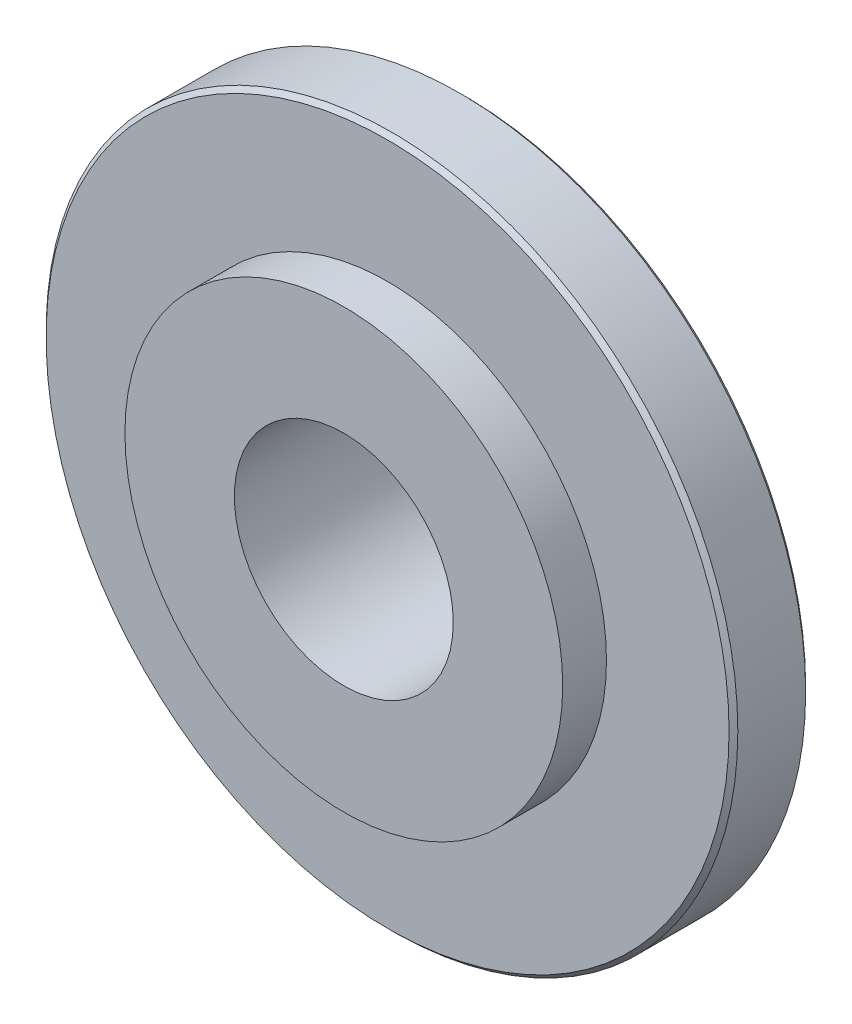
ISO-10303-21;
HEADER;
FILE_DESCRIPTION(('STEP AP214'),'2;1');
FILE_NAME('part.step','',(''),(''),'','','');
FILE_SCHEMA(('AUTOMOTIVE_DESIGN { 1 0 10303 214 1 1 1 1 }'));
ENDSEC;
DATA;
#1=APPLICATION_CONTEXT('core data for automotive mechanical design processes');
#2=APPLICATION_PROTOCOL_DEFINITION('international standard','automotive_design',2000,#1);
#3=PRODUCT_CONTEXT('',#1,'mechanical');
#4=PRODUCT('Part','Part','',(#3));
#5=PRODUCT_RELATED_PRODUCT_CATEGORY('part','',(#4));
#6=PRODUCT_DEFINITION_FORMATION('','',#4);
#7=PRODUCT_DEFINITION_CONTEXT('part definition',#1,'design');
#8=PRODUCT_DEFINITION('design','',#6,#7);
#9=PRODUCT_DEFINITION_SHAPE('','',#8);
#10=(LENGTH_UNIT() NAMED_UNIT(*) SI_UNIT(.MILLI.,.METRE.));
#11=(NAMED_UNIT(*) PLANE_ANGLE_UNIT() SI_UNIT($,.RADIAN.));
#12=(NAMED_UNIT(*) SI_UNIT($,.STERADIAN.) SOLID_ANGLE_UNIT());
#13=UNCERTAINTY_MEASURE_WITH_UNIT(LENGTH_MEASURE(1.E-05),#10,'distance_accuracy_value','');
#14=(GEOMETRIC_REPRESENTATION_CONTEXT(3) GLOBAL_UNCERTAINTY_ASSIGNED_CONTEXT((#13)) GLOBAL_UNIT_ASSIGNED_CONTEXT((#10,
#11,#12)) REPRESENTATION_CONTEXT('',''));
#15=CARTESIAN_POINT('',(0.,0.,0.));
#16=DIRECTION('',(0.,0.,1.));
#17=DIRECTION('',(1.,0.,0.));
#18=AXIS2_PLACEMENT_3D('',#15,#16,#17);
#19=CARTESIAN_POINT('',(0.,0.,2.));
#20=DIRECTION('',(0.,0.,-1.));
#21=DIRECTION('',(-1.,0.,0.));
#22=AXIS2_PLACEMENT_3D('',#19,#20,#21);
#23=CYLINDRICAL_SURFACE('',#22,10.);
#24=CARTESIAN_POINT('',(0.,0.,2.));
#25=DIRECTION('',(0.,0.,1.));
#26=DIRECTION('',(1.,0.,0.));
#27=AXIS2_PLACEMENT_3D('',#24,#25,#26);
#28=CIRCLE('',#27,10.);
#29=CARTESIAN_POINT('',(10.,0.,2.));
#30=VERTEX_POINT('',#29);
#31=EDGE_CURVE('E69',#30,#30,#28,.T.);
#32=ORIENTED_EDGE('',*,*,#31,.F.);
#33=EDGE_LOOP('',(#32));
#34=FACE_BOUND('',#33,.T.);
#35=CARTESIAN_POINT('',(0.,0.,0.));
#36=DIRECTION('',(0.,0.,1.));
#37=DIRECTION('',(1.,0.,0.));
#38=AXIS2_PLACEMENT_3D('',#35,#36,#37);
#39=CIRCLE('',#38,10.);
#40=CARTESIAN_POINT('',(10.,0.,0.));
#41=VERTEX_POINT('',#40);
#42=EDGE_CURVE('E66',#41,#41,#39,.T.);
#43=ORIENTED_EDGE('',*,*,#42,.T.);
#44=EDGE_LOOP('',(#43));
#45=FACE_BOUND('',#44,.T.);
#46=ADVANCED_FACE('F44',(#34,#45),#23,.T.);
#47=CARTESIAN_POINT('',(0.,0.,0.));
#48=DIRECTION('',(0.,0.,1.));
#49=DIRECTION('',(1.,0.,0.));
#50=AXIS2_PLACEMENT_3D('',#47,#48,#49);
#51=PLANE('',#50);
#52=CARTESIAN_POINT('',(0.,0.,0.));
#53=DIRECTION('',(0.,0.,1.));
#54=DIRECTION('',(1.,0.,0.));
#55=AXIS2_PLACEMENT_3D('',#52,#53,#54);
#56=CIRCLE('',#55,5.);
#57=CARTESIAN_POINT('',(5.,0.,0.));
#58=VERTEX_POINT('',#57);
#59=EDGE_CURVE('E77',#58,#58,#56,.T.);
#60=ORIENTED_EDGE('',*,*,#59,.T.);
#61=EDGE_LOOP('',(#60));
#62=FACE_BOUND('',#61,.T.);
#63=ORIENTED_EDGE('',*,*,#42,.F.);
#64=EDGE_LOOP('',(#63));
#65=FACE_BOUND('',#64,.T.);
#66=ADVANCED_FACE('F109',(#62,#65),#51,.F.);
#67=CARTESIAN_POINT('',(0.,0.,5.5));
#68=DIRECTION('',(0.,0.,-1.));
#69=DIRECTION('',(-1.,0.,0.));
#70=AXIS2_PLACEMENT_3D('',#67,#68,#69);
#71=CYLINDRICAL_SURFACE('',#70,15.8);
#72=CARTESIAN_POINT('',(0.,0.,2.2));
#73=DIRECTION('',(0.,0.,1.));
#74=DIRECTION('',(1.,0.,0.));
#75=AXIS2_PLACEMENT_3D('',#72,#73,#74);
#76=CIRCLE('',#75,15.8);
#77=CARTESIAN_POINT('',(15.8,0.,2.2));
#78=VERTEX_POINT('',#77);
#79=EDGE_CURVE('E56',#78,#78,#76,.T.);
#80=ORIENTED_EDGE('',*,*,#79,.T.);
#81=EDGE_LOOP('',(#80));
#82=FACE_BOUND('',#81,.T.);
#83=CARTESIAN_POINT('',(0.,0.,5.30000000000001));
#84=DIRECTION('',(0.,0.,1.));
#85=DIRECTION('',(1.,0.,0.));
#86=AXIS2_PLACEMENT_3D('',#83,#84,#85);
#87=CIRCLE('',#86,15.8);
#88=CARTESIAN_POINT('',(15.8,0.,5.30000000000001));
#89=VERTEX_POINT('',#88);
#90=EDGE_CURVE('E60',#89,#89,#87,.F.);
#91=ORIENTED_EDGE('',*,*,#90,.T.);
#92=EDGE_LOOP('',(#91));
#93=FACE_BOUND('',#92,.T.);
#94=ADVANCED_FACE('F102',(#82,#93),#71,.T.);
#95=CARTESIAN_POINT('',(0.,0.,5.5));
#96=DIRECTION('',(0.,0.,1.));
#97=DIRECTION('',(1.,0.,0.));
#98=AXIS2_PLACEMENT_3D('',#95,#96,#97);
#99=PLANE('',#98);
#100=CARTESIAN_POINT('',(0.,0.,5.5));
#101=DIRECTION('',(0.,0.,1.));
#102=DIRECTION('',(1.,0.,0.));
#103=AXIS2_PLACEMENT_3D('',#100,#101,#102);
#104=CIRCLE('',#103,15.6);
#105=CARTESIAN_POINT('',(15.6,0.,5.5));
#106=VERTEX_POINT('',#105);
#107=EDGE_CURVE('E10',#106,#106,#104,.T.);
#108=ORIENTED_EDGE('',*,*,#107,.T.);
#109=EDGE_LOOP('',(#108));
#110=FACE_BOUND('',#109,.T.);
#111=CARTESIAN_POINT('',(0.,0.,5.5));
#112=DIRECTION('',(0.,0.,1.));
#113=DIRECTION('',(1.,0.,0.));
#114=AXIS2_PLACEMENT_3D('',#111,#112,#113);
#115=CIRCLE('',#114,10.);
#116=CARTESIAN_POINT('',(10.,0.,5.5));
#117=VERTEX_POINT('',#116);
#118=EDGE_CURVE('E65',#117,#117,#115,.T.);
#119=ORIENTED_EDGE('',*,*,#118,.F.);
#120=EDGE_LOOP('',(#119));
#121=FACE_BOUND('',#120,.T.);
#122=ADVANCED_FACE('F100',(#110,#121),#99,.T.);
#123=CARTESIAN_POINT('',(0.,0.,2.));
#124=DIRECTION('',(0.,0.,1.));
#125=DIRECTION('',(1.,0.,0.));
#126=AXIS2_PLACEMENT_3D('',#123,#124,#125);
#127=PLANE('',#126);
#128=CARTESIAN_POINT('',(0.,0.,2.));
#129=DIRECTION('',(0.,0.,1.));
#130=DIRECTION('',(1.,0.,0.));
#131=AXIS2_PLACEMENT_3D('',#128,#129,#130);
#132=CIRCLE('',#131,15.6);
#133=CARTESIAN_POINT('',(15.6,0.,2.));
#134=VERTEX_POINT('',#133);
#135=EDGE_CURVE('E52',#134,#134,#132,.F.);
#136=ORIENTED_EDGE('',*,*,#135,.T.);
#137=EDGE_LOOP('',(#136));
#138=FACE_BOUND('',#137,.T.);
#139=ORIENTED_EDGE('',*,*,#31,.T.);
#140=EDGE_LOOP('',(#139));
#141=FACE_BOUND('',#140,.T.);
#142=ADVANCED_FACE('F96',(#138,#141),#127,.F.);
#143=CARTESIAN_POINT('',(0.,0.,7.5));
#144=DIRECTION('',(0.,0.,-1.));
#145=DIRECTION('',(-1.,0.,0.));
#146=AXIS2_PLACEMENT_3D('',#143,#144,#145);
#147=CYLINDRICAL_SURFACE('',#146,10.);
#148=CARTESIAN_POINT('',(0.,0.,7.5));
#149=DIRECTION('',(0.,0.,1.));
#150=DIRECTION('',(1.,0.,0.));
#151=AXIS2_PLACEMENT_3D('',#148,#149,#150);
#152=CIRCLE('',#151,10.);
#153=CARTESIAN_POINT('',(10.,0.,7.5));
#154=VERTEX_POINT('',#153);
#155=EDGE_CURVE('E70',#154,#154,#152,.T.);
#156=ORIENTED_EDGE('',*,*,#155,.F.);
#157=EDGE_LOOP('',(#156));
#158=FACE_BOUND('',#157,.T.);
#159=ORIENTED_EDGE('',*,*,#118,.T.);
#160=EDGE_LOOP('',(#159));
#161=FACE_BOUND('',#160,.T.);
#162=ADVANCED_FACE('F90',(#158,#161),#147,.T.);
#163=CARTESIAN_POINT('',(0.,0.,7.5));
#164=DIRECTION('',(0.,0.,1.));
#165=DIRECTION('',(1.,0.,0.));
#166=AXIS2_PLACEMENT_3D('',#163,#164,#165);
#167=PLANE('',#166);
#168=CARTESIAN_POINT('',(0.,0.,7.5));
#169=DIRECTION('',(0.,0.,1.));
#170=DIRECTION('',(1.,0.,0.));
#171=AXIS2_PLACEMENT_3D('',#168,#169,#170);
#172=CIRCLE('',#171,5.);
#173=CARTESIAN_POINT('',(5.,0.,7.5));
#174=VERTEX_POINT('',#173);
#175=EDGE_CURVE('E80',#174,#174,#172,.T.);
#176=ORIENTED_EDGE('',*,*,#175,.F.);
#177=EDGE_LOOP('',(#176));
#178=FACE_BOUND('',#177,.T.);
#179=ORIENTED_EDGE('',*,*,#155,.T.);
#180=EDGE_LOOP('',(#179));
#181=FACE_BOUND('',#180,.T.);
#182=ADVANCED_FACE('F87',(#178,#181),#167,.T.);
#183=CARTESIAN_POINT('',(0.,0.,-2.5));
#184=DIRECTION('',(0.,0.,1.));
#185=DIRECTION('',(1.,0.,0.));
#186=AXIS2_PLACEMENT_3D('',#183,#184,#185);
#187=CYLINDRICAL_SURFACE('',#186,5.);
#188=ORIENTED_EDGE('',*,*,#175,.T.);
#189=EDGE_LOOP('',(#188));
#190=FACE_BOUND('',#189,.T.);
#191=ORIENTED_EDGE('',*,*,#59,.F.);
#192=EDGE_LOOP('',(#191));
#193=FACE_BOUND('',#192,.T.);
#194=ADVANCED_FACE('F84',(#190,#193),#187,.F.);
#195=CARTESIAN_POINT('',(0.,0.,2.2));
#196=DIRECTION('',(0.,0.,1.));
#197=DIRECTION('',(1.,0.,0.));
#198=AXIS2_PLACEMENT_3D('',#195,#196,#197);
#199=CONICAL_SURFACE('',#198,15.8,0.78539816339744);
#200=ORIENTED_EDGE('',*,*,#135,.F.);
#201=EDGE_LOOP('',(#200));
#202=FACE_BOUND('',#201,.T.);
#203=ORIENTED_EDGE('',*,*,#79,.F.);
#204=EDGE_LOOP('',(#203));
#205=FACE_BOUND('',#204,.T.);
#206=ADVANCED_FACE('F123',(#202,#205),#199,.T.);
#207=CARTESIAN_POINT('',(0.,0.,5.5));
#208=DIRECTION('',(0.,0.,-1.));
#209=DIRECTION('',(-1.,0.,0.));
#210=AXIS2_PLACEMENT_3D('',#207,#208,#209);
#211=CONICAL_SURFACE('',#210,15.6,0.785398163397448);
#212=ORIENTED_EDGE('',*,*,#90,.F.);
#213=EDGE_LOOP('',(#212));
#214=FACE_BOUND('',#213,.T.);
#215=ORIENTED_EDGE('',*,*,#107,.F.);
#216=EDGE_LOOP('',(#215));
#217=FACE_BOUND('',#216,.T.);
#218=ADVANCED_FACE('F47',(#214,#217),#211,.T.);
#219=CLOSED_SHELL('',(#46,#66,#94,#122,#142,#162,#182,#194,#206,#218));
#220=MANIFOLD_SOLID_BREP('B2',#219);
#221=ADVANCED_BREP_SHAPE_REPRESENTATION('',(#18,#220),#14);
#222=SHAPE_DEFINITION_REPRESENTATION(#9,#221);
ENDSEC;
END-ISO-10303-21;
